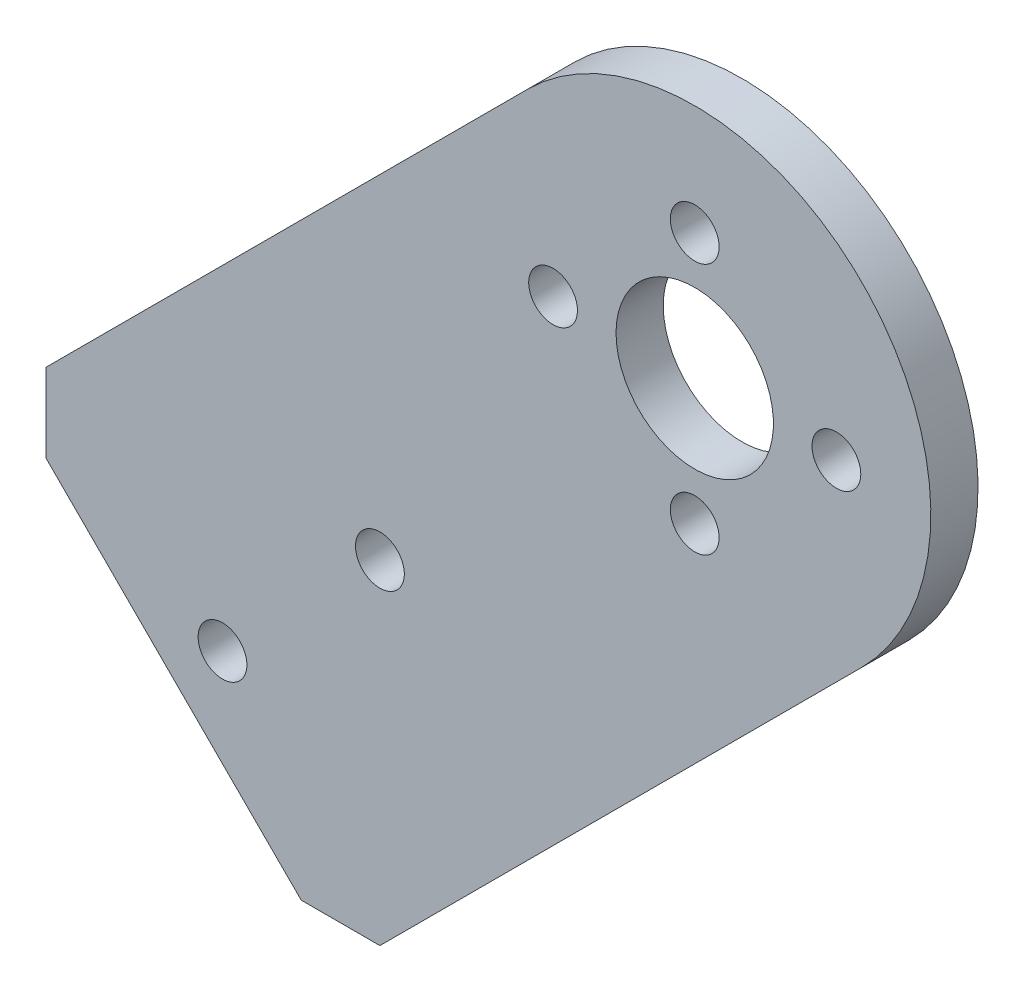
ISO-10303-21;
HEADER;
FILE_DESCRIPTION(('STEP AP214'),'2;1');
FILE_NAME('part.step','',(''),(''),'','','');
FILE_SCHEMA(('AUTOMOTIVE_DESIGN { 1 0 10303 214 1 1 1 1 }'));
ENDSEC;
DATA;
#1=APPLICATION_CONTEXT('core data for automotive mechanical design processes');
#2=APPLICATION_PROTOCOL_DEFINITION('international standard','automotive_design',2000,#1);
#3=PRODUCT_CONTEXT('',#1,'mechanical');
#4=PRODUCT('Part','Part','',(#3));
#5=PRODUCT_RELATED_PRODUCT_CATEGORY('part','',(#4));
#6=PRODUCT_DEFINITION_FORMATION('','',#4);
#7=PRODUCT_DEFINITION_CONTEXT('part definition',#1,'design');
#8=PRODUCT_DEFINITION('design','',#6,#7);
#9=PRODUCT_DEFINITION_SHAPE('','',#8);
#10=(LENGTH_UNIT() NAMED_UNIT(*) SI_UNIT(.MILLI.,.METRE.));
#11=(NAMED_UNIT(*) PLANE_ANGLE_UNIT() SI_UNIT($,.RADIAN.));
#12=(NAMED_UNIT(*) SI_UNIT($,.STERADIAN.) SOLID_ANGLE_UNIT());
#13=UNCERTAINTY_MEASURE_WITH_UNIT(LENGTH_MEASURE(1.E-05),#10,'distance_accuracy_value','');
#14=(GEOMETRIC_REPRESENTATION_CONTEXT(3) GLOBAL_UNCERTAINTY_ASSIGNED_CONTEXT((#13)) GLOBAL_UNIT_ASSIGNED_CONTEXT((#10,
#11,#12)) REPRESENTATION_CONTEXT('',''));
#15=CARTESIAN_POINT('',(0.,0.,0.));
#16=DIRECTION('',(0.,0.,1.));
#17=DIRECTION('',(1.,0.,0.));
#18=AXIS2_PLACEMENT_3D('',#15,#16,#17);
#19=CARTESIAN_POINT('',(0.,0.,3.));
#20=DIRECTION('',(0.,0.,-1.));
#21=DIRECTION('',(-1.,0.,0.));
#22=AXIS2_PLACEMENT_3D('',#19,#20,#21);
#23=PLANE('',#22);
#24=CARTESIAN_POINT('',(70.,70.,3.));
#25=DIRECTION('',(0.,0.,-1.));
#26=DIRECTION('',(-1.,0.,0.));
#27=AXIS2_PLACEMENT_3D('',#24,#25,#26);
#28=CIRCLE('',#27,1.54999999999999);
#29=CARTESIAN_POINT('',(68.45,70.,3.));
#30=VERTEX_POINT('',#29);
#31=EDGE_CURVE('E161',#30,#30,#28,.T.);
#32=ORIENTED_EDGE('',*,*,#31,.T.);
#33=EDGE_LOOP('',(#32));
#34=FACE_BOUND('',#33,.T.);
#35=DIRECTION('',(0.707106781186547,-0.707106781186548,0.));
#36=VECTOR('',#35,1.);
#37=CARTESIAN_POINT('',(56.8933982822018,56.8933982822018,3.));
#38=LINE('',#37,#36);
#39=CARTESIAN_POINT('',(48.7867965644036,65.,3.));
#40=VERTEX_POINT('',#39);
#41=CARTESIAN_POINT('',(65.,48.7867965644036,3.));
#42=VERTEX_POINT('',#41);
#43=EDGE_CURVE('E168',#40,#42,#38,.T.);
#44=ORIENTED_EDGE('',*,*,#43,.T.);
#45=DIRECTION('',(1.,0.,0.));
#46=VECTOR('',#45,1.);
#47=CARTESIAN_POINT('',(0.,48.7867965644036,3.));
#48=LINE('',#47,#46);
#49=CARTESIAN_POINT('',(70.,48.7867965644036,3.));
#50=VERTEX_POINT('',#49);
#51=EDGE_CURVE('E101',#42,#50,#48,.T.);
#52=ORIENTED_EDGE('',*,*,#51,.T.);
#53=DIRECTION('',(0.707106781186547,0.707106781186548,0.));
#54=VECTOR('',#53,1.);
#55=CARTESIAN_POINT('',(100.606601717798,79.3933982822018,3.));
#56=LINE('',#55,#54);
#57=CARTESIAN_POINT('',(100.606601717798,79.3933982822018,3.));
#58=VERTEX_POINT('',#57);
#59=EDGE_CURVE('E81',#50,#58,#56,.T.);
#60=ORIENTED_EDGE('',*,*,#59,.T.);
#61=CARTESIAN_POINT('',(90.,90.,3.));
#62=DIRECTION('',(0.,0.,1.));
#63=DIRECTION('',(-1.,0.,0.));
#64=AXIS2_PLACEMENT_3D('',#61,#62,#63);
#65=CIRCLE('',#64,15.);
#66=CARTESIAN_POINT('',(79.3933982822018,100.606601717798,3.));
#67=VERTEX_POINT('',#66);
#68=EDGE_CURVE('E88',#58,#67,#65,.T.);
#69=ORIENTED_EDGE('',*,*,#68,.T.);
#70=DIRECTION('',(-0.707106781186547,-0.707106781186547,0.));
#71=VECTOR('',#70,1.);
#72=CARTESIAN_POINT('',(79.3933982822018,100.606601717798,3.));
#73=LINE('',#72,#71);
#74=CARTESIAN_POINT('',(48.7867965644036,70.,3.));
#75=VERTEX_POINT('',#74);
#76=EDGE_CURVE('E94',#67,#75,#73,.T.);
#77=ORIENTED_EDGE('',*,*,#76,.T.);
#78=DIRECTION('',(0.,-1.,0.));
#79=VECTOR('',#78,1.);
#80=CARTESIAN_POINT('',(48.7867965644036,0.,3.));
#81=LINE('',#80,#79);
#82=EDGE_CURVE('E55',#75,#40,#81,.T.);
#83=ORIENTED_EDGE('',*,*,#82,.T.);
#84=EDGE_LOOP('',(#44,#52,#60,#69,#77,#83));
#85=FACE_BOUND('',#84,.T.);
#86=CARTESIAN_POINT('',(60.,60.,3.));
#87=DIRECTION('',(0.,0.,1.));
#88=DIRECTION('',(1.,0.,0.));
#89=AXIS2_PLACEMENT_3D('',#86,#87,#88);
#90=CIRCLE('',#89,1.55);
#91=CARTESIAN_POINT('',(61.55,60.,3.));
#92=VERTEX_POINT('',#91);
#93=EDGE_CURVE('E11',#92,#92,#90,.T.);
#94=ORIENTED_EDGE('',*,*,#93,.F.);
#95=EDGE_LOOP('',(#94));
#96=FACE_BOUND('',#95,.T.);
#97=CARTESIAN_POINT('',(99.,89.9999999999999,3.));
#98=DIRECTION('',(0.,0.,1.));
#99=DIRECTION('',(1.,0.,0.));
#100=AXIS2_PLACEMENT_3D('',#97,#98,#99);
#101=CIRCLE('',#100,1.54999999999999);
#102=CARTESIAN_POINT('',(100.55,89.9999999999999,3.));
#103=VERTEX_POINT('',#102);
#104=EDGE_CURVE('E157',#103,#103,#101,.T.);
#105=ORIENTED_EDGE('',*,*,#104,.F.);
#106=EDGE_LOOP('',(#105));
#107=FACE_BOUND('',#106,.T.);
#108=CARTESIAN_POINT('',(90.,98.,3.));
#109=DIRECTION('',(0.,0.,1.));
#110=DIRECTION('',(-1.,0.,0.));
#111=AXIS2_PLACEMENT_3D('',#108,#109,#110);
#112=CIRCLE('',#111,1.54999999999999);
#113=CARTESIAN_POINT('',(88.45,98.,3.));
#114=VERTEX_POINT('',#113);
#115=EDGE_CURVE('E149',#114,#114,#112,.T.);
#116=ORIENTED_EDGE('',*,*,#115,.F.);
#117=EDGE_LOOP('',(#116));
#118=FACE_BOUND('',#117,.T.);
#119=CARTESIAN_POINT('',(90.,82.,3.));
#120=DIRECTION('',(0.,0.,1.));
#121=DIRECTION('',(1.,0.,0.));
#122=AXIS2_PLACEMENT_3D('',#119,#120,#121);
#123=CIRCLE('',#122,1.54999999999999);
#124=CARTESIAN_POINT('',(91.55,82.,3.));
#125=VERTEX_POINT('',#124);
#126=EDGE_CURVE('E141',#125,#125,#123,.T.);
#127=ORIENTED_EDGE('',*,*,#126,.F.);
#128=EDGE_LOOP('',(#127));
#129=FACE_BOUND('',#128,.T.);
#130=CARTESIAN_POINT('',(90.,90.,3.));
#131=DIRECTION('',(0.,0.,1.));
#132=DIRECTION('',(-1.,0.,0.));
#133=AXIS2_PLACEMENT_3D('',#130,#131,#132);
#134=CIRCLE('',#133,5.00000000000001);
#135=CARTESIAN_POINT('',(85.,90.,3.));
#136=VERTEX_POINT('',#135);
#137=EDGE_CURVE('E133',#136,#136,#134,.T.);
#138=ORIENTED_EDGE('',*,*,#137,.F.);
#139=EDGE_LOOP('',(#138));
#140=FACE_BOUND('',#139,.T.);
#141=CARTESIAN_POINT('',(81.,90.,3.));
#142=DIRECTION('',(0.,0.,1.));
#143=DIRECTION('',(-1.,0.,0.));
#144=AXIS2_PLACEMENT_3D('',#141,#142,#143);
#145=CIRCLE('',#144,1.54999999999999);
#146=CARTESIAN_POINT('',(79.45,90.,3.));
#147=VERTEX_POINT('',#146);
#148=EDGE_CURVE('E125',#147,#147,#145,.T.);
#149=ORIENTED_EDGE('',*,*,#148,.F.);
#150=EDGE_LOOP('',(#149));
#151=FACE_BOUND('',#150,.T.);
#152=ADVANCED_FACE('F39',(#34,#85,#96,#107,#118,#129,#140,#151),#23,.F.);
#153=CARTESIAN_POINT('',(0.,0.,0.));
#154=DIRECTION('',(0.,0.,-1.));
#155=DIRECTION('',(-1.,0.,0.));
#156=AXIS2_PLACEMENT_3D('',#153,#154,#155);
#157=PLANE('',#156);
#158=CARTESIAN_POINT('',(70.,70.,0.));
#159=DIRECTION('',(0.,0.,-1.));
#160=DIRECTION('',(-1.,0.,0.));
#161=AXIS2_PLACEMENT_3D('',#158,#159,#160);
#162=CIRCLE('',#161,1.54999999999999);
#163=CARTESIAN_POINT('',(68.45,70.,0.));
#164=VERTEX_POINT('',#163);
#165=EDGE_CURVE('E195',#164,#164,#162,.T.);
#166=ORIENTED_EDGE('',*,*,#165,.F.);
#167=EDGE_LOOP('',(#166));
#168=FACE_BOUND('',#167,.T.);
#169=DIRECTION('',(1.,0.,0.));
#170=VECTOR('',#169,1.);
#171=CARTESIAN_POINT('',(70.,48.7867965644036,0.));
#172=LINE('',#171,#170);
#173=CARTESIAN_POINT('',(65.,48.7867965644036,0.));
#174=VERTEX_POINT('',#173);
#175=CARTESIAN_POINT('',(70.,48.7867965644036,0.));
#176=VERTEX_POINT('',#175);
#177=EDGE_CURVE('E180',#174,#176,#172,.T.);
#178=ORIENTED_EDGE('',*,*,#177,.F.);
#179=DIRECTION('',(0.707106781186547,-0.707106781186548,0.));
#180=VECTOR('',#179,1.);
#181=CARTESIAN_POINT('',(65.,48.7867965644036,0.));
#182=LINE('',#181,#180);
#183=CARTESIAN_POINT('',(48.7867965644036,65.,0.));
#184=VERTEX_POINT('',#183);
#185=EDGE_CURVE('E187',#184,#174,#182,.T.);
#186=ORIENTED_EDGE('',*,*,#185,.F.);
#187=DIRECTION('',(0.,-1.,0.));
#188=VECTOR('',#187,1.);
#189=CARTESIAN_POINT('',(48.7867965644036,65.,0.));
#190=LINE('',#189,#188);
#191=CARTESIAN_POINT('',(48.7867965644036,70.,0.));
#192=VERTEX_POINT('',#191);
#193=EDGE_CURVE('E191',#192,#184,#190,.T.);
#194=ORIENTED_EDGE('',*,*,#193,.F.);
#195=DIRECTION('',(-0.707106781186547,-0.707106781186547,0.));
#196=VECTOR('',#195,1.);
#197=CARTESIAN_POINT('',(79.3933982822018,100.606601717798,0.));
#198=LINE('',#197,#196);
#199=CARTESIAN_POINT('',(79.3933982822018,100.606601717798,0.));
#200=VERTEX_POINT('',#199);
#201=EDGE_CURVE('E107',#200,#192,#198,.T.);
#202=ORIENTED_EDGE('',*,*,#201,.F.);
#203=CARTESIAN_POINT('',(90.,90.,0.));
#204=DIRECTION('',(0.,0.,1.));
#205=DIRECTION('',(-1.,0.,0.));
#206=AXIS2_PLACEMENT_3D('',#203,#204,#205);
#207=CIRCLE('',#206,15.);
#208=CARTESIAN_POINT('',(100.606601717798,79.3933982822018,0.));
#209=VERTEX_POINT('',#208);
#210=EDGE_CURVE('E103',#209,#200,#207,.T.);
#211=ORIENTED_EDGE('',*,*,#210,.F.);
#212=DIRECTION('',(0.707106781186547,0.707106781186548,0.));
#213=VECTOR('',#212,1.);
#214=CARTESIAN_POINT('',(100.606601717798,79.3933982822018,0.));
#215=LINE('',#214,#213);
#216=EDGE_CURVE('E83',#176,#209,#215,.T.);
#217=ORIENTED_EDGE('',*,*,#216,.F.);
#218=EDGE_LOOP('',(#178,#186,#194,#202,#211,#217));
#219=FACE_BOUND('',#218,.T.);
#220=CARTESIAN_POINT('',(60.,60.,0.));
#221=DIRECTION('',(0.,0.,1.));
#222=DIRECTION('',(1.,0.,0.));
#223=AXIS2_PLACEMENT_3D('',#220,#221,#222);
#224=CIRCLE('',#223,1.55);
#225=CARTESIAN_POINT('',(61.55,60.,0.));
#226=VERTEX_POINT('',#225);
#227=EDGE_CURVE('E43',#226,#226,#224,.T.);
#228=ORIENTED_EDGE('',*,*,#227,.T.);
#229=EDGE_LOOP('',(#228));
#230=FACE_BOUND('',#229,.T.);
#231=CARTESIAN_POINT('',(99.,89.9999999999999,0.));
#232=DIRECTION('',(0.,0.,1.));
#233=DIRECTION('',(1.,0.,0.));
#234=AXIS2_PLACEMENT_3D('',#231,#232,#233);
#235=CIRCLE('',#234,1.54999999999999);
#236=CARTESIAN_POINT('',(100.55,89.9999999999999,0.));
#237=VERTEX_POINT('',#236);
#238=EDGE_CURVE('E153',#237,#237,#235,.T.);
#239=ORIENTED_EDGE('',*,*,#238,.T.);
#240=EDGE_LOOP('',(#239));
#241=FACE_BOUND('',#240,.T.);
#242=CARTESIAN_POINT('',(90.,98.,0.));
#243=DIRECTION('',(0.,0.,1.));
#244=DIRECTION('',(-1.,0.,0.));
#245=AXIS2_PLACEMENT_3D('',#242,#243,#244);
#246=CIRCLE('',#245,1.54999999999999);
#247=CARTESIAN_POINT('',(88.45,98.,0.));
#248=VERTEX_POINT('',#247);
#249=EDGE_CURVE('E145',#248,#248,#246,.T.);
#250=ORIENTED_EDGE('',*,*,#249,.T.);
#251=EDGE_LOOP('',(#250));
#252=FACE_BOUND('',#251,.T.);
#253=CARTESIAN_POINT('',(90.,82.,0.));
#254=DIRECTION('',(0.,0.,1.));
#255=DIRECTION('',(1.,0.,0.));
#256=AXIS2_PLACEMENT_3D('',#253,#254,#255);
#257=CIRCLE('',#256,1.54999999999999);
#258=CARTESIAN_POINT('',(91.55,82.,0.));
#259=VERTEX_POINT('',#258);
#260=EDGE_CURVE('E137',#259,#259,#257,.T.);
#261=ORIENTED_EDGE('',*,*,#260,.T.);
#262=EDGE_LOOP('',(#261));
#263=FACE_BOUND('',#262,.T.);
#264=CARTESIAN_POINT('',(90.,90.,0.));
#265=DIRECTION('',(0.,0.,1.));
#266=DIRECTION('',(-1.,0.,0.));
#267=AXIS2_PLACEMENT_3D('',#264,#265,#266);
#268=CIRCLE('',#267,5.00000000000001);
#269=CARTESIAN_POINT('',(85.,90.,0.));
#270=VERTEX_POINT('',#269);
#271=EDGE_CURVE('E129',#270,#270,#268,.T.);
#272=ORIENTED_EDGE('',*,*,#271,.T.);
#273=EDGE_LOOP('',(#272));
#274=FACE_BOUND('',#273,.T.);
#275=CARTESIAN_POINT('',(81.,90.,0.));
#276=DIRECTION('',(0.,0.,1.));
#277=DIRECTION('',(-1.,0.,0.));
#278=AXIS2_PLACEMENT_3D('',#275,#276,#277);
#279=CIRCLE('',#278,1.54999999999999);
#280=CARTESIAN_POINT('',(79.45,90.,0.));
#281=VERTEX_POINT('',#280);
#282=EDGE_CURVE('E95',#281,#281,#279,.T.);
#283=ORIENTED_EDGE('',*,*,#282,.T.);
#284=EDGE_LOOP('',(#283));
#285=FACE_BOUND('',#284,.T.);
#286=ADVANCED_FACE('F41',(#168,#219,#230,#241,#252,#263,#274,#285),#157,.T.);
#287=CARTESIAN_POINT('',(60.,60.,3.));
#288=DIRECTION('',(0.,0.,-1.));
#289=DIRECTION('',(-1.,0.,0.));
#290=AXIS2_PLACEMENT_3D('',#287,#288,#289);
#291=CYLINDRICAL_SURFACE('',#290,1.55);
#292=ORIENTED_EDGE('',*,*,#93,.T.);
#293=EDGE_LOOP('',(#292));
#294=FACE_BOUND('',#293,.T.);
#295=ORIENTED_EDGE('',*,*,#227,.F.);
#296=EDGE_LOOP('',(#295));
#297=FACE_BOUND('',#296,.T.);
#298=ADVANCED_FACE('F205',(#294,#297),#291,.F.);
#299=CARTESIAN_POINT('',(90.,90.,0.));
#300=DIRECTION('',(0.,0.,1.));
#301=DIRECTION('',(1.,0.,0.));
#302=AXIS2_PLACEMENT_3D('',#299,#300,#301);
#303=CYLINDRICAL_SURFACE('',#302,15.);
#304=ORIENTED_EDGE('',*,*,#68,.F.);
#305=DIRECTION('',(0.,0.,1.));
#306=VECTOR('',#305,1.);
#307=CARTESIAN_POINT('',(100.606601717798,79.3933982822018,0.));
#308=LINE('',#307,#306);
#309=EDGE_CURVE('E64',#209,#58,#308,.T.);
#310=ORIENTED_EDGE('',*,*,#309,.F.);
#311=ORIENTED_EDGE('',*,*,#210,.T.);
#312=DIRECTION('',(0.,0.,1.));
#313=VECTOR('',#312,1.);
#314=CARTESIAN_POINT('',(79.3933982822018,100.606601717798,0.));
#315=LINE('',#314,#313);
#316=EDGE_CURVE('E90',#200,#67,#315,.T.);
#317=ORIENTED_EDGE('',*,*,#316,.T.);
#318=EDGE_LOOP('',(#304,#310,#311,#317));
#319=FACE_BOUND('',#318,.T.);
#320=ADVANCED_FACE('F89',(#319),#303,.T.);
#321=CARTESIAN_POINT('',(100.606601717798,79.3933982822018,0.));
#322=DIRECTION('',(0.707106781186548,-0.707106781186547,0.));
#323=DIRECTION('',(0.707106781186547,0.707106781186548,0.));
#324=AXIS2_PLACEMENT_3D('',#321,#322,#323);
#325=PLANE('',#324);
#326=ORIENTED_EDGE('',*,*,#59,.F.);
#327=DIRECTION('',(0.,0.,1.));
#328=VECTOR('',#327,1.);
#329=CARTESIAN_POINT('',(70.,48.7867965644036,0.));
#330=LINE('',#329,#328);
#331=EDGE_CURVE('E85',#176,#50,#330,.T.);
#332=ORIENTED_EDGE('',*,*,#331,.F.);
#333=ORIENTED_EDGE('',*,*,#216,.T.);
#334=ORIENTED_EDGE('',*,*,#309,.T.);
#335=EDGE_LOOP('',(#326,#332,#333,#334));
#336=FACE_BOUND('',#335,.T.);
#337=ADVANCED_FACE('F77',(#336),#325,.T.);
#338=CARTESIAN_POINT('',(79.3933982822018,100.606601717798,0.));
#339=DIRECTION('',(-0.707106781186548,0.707106781186548,0.));
#340=DIRECTION('',(-0.707106781186548,-0.707106781186548,0.));
#341=AXIS2_PLACEMENT_3D('',#338,#339,#340);
#342=PLANE('',#341);
#343=ORIENTED_EDGE('',*,*,#76,.F.);
#344=ORIENTED_EDGE('',*,*,#316,.F.);
#345=ORIENTED_EDGE('',*,*,#201,.T.);
#346=DIRECTION('',(0.,0.,1.));
#347=VECTOR('',#346,1.);
#348=CARTESIAN_POINT('',(48.7867965644036,70.,0.));
#349=LINE('',#348,#347);
#350=EDGE_CURVE('E114',#192,#75,#349,.T.);
#351=ORIENTED_EDGE('',*,*,#350,.T.);
#352=EDGE_LOOP('',(#343,#344,#345,#351));
#353=FACE_BOUND('',#352,.T.);
#354=ADVANCED_FACE('F227',(#353),#342,.T.);
#355=CARTESIAN_POINT('',(81.,90.,0.));
#356=DIRECTION('',(0.,0.,1.));
#357=DIRECTION('',(1.,0.,0.));
#358=AXIS2_PLACEMENT_3D('',#355,#356,#357);
#359=CYLINDRICAL_SURFACE('',#358,1.54999999999999);
#360=ORIENTED_EDGE('',*,*,#282,.F.);
#361=EDGE_LOOP('',(#360));
#362=FACE_BOUND('',#361,.T.);
#363=ORIENTED_EDGE('',*,*,#148,.T.);
#364=EDGE_LOOP('',(#363));
#365=FACE_BOUND('',#364,.T.);
#366=ADVANCED_FACE('F223',(#362,#365),#359,.F.);
#367=CARTESIAN_POINT('',(90.,90.,0.));
#368=DIRECTION('',(0.,0.,1.));
#369=DIRECTION('',(1.,0.,0.));
#370=AXIS2_PLACEMENT_3D('',#367,#368,#369);
#371=CYLINDRICAL_SURFACE('',#370,5.00000000000001);
#372=ORIENTED_EDGE('',*,*,#271,.F.);
#373=EDGE_LOOP('',(#372));
#374=FACE_BOUND('',#373,.T.);
#375=ORIENTED_EDGE('',*,*,#137,.T.);
#376=EDGE_LOOP('',(#375));
#377=FACE_BOUND('',#376,.T.);
#378=ADVANCED_FACE('F226',(#374,#377),#371,.F.);
#379=CARTESIAN_POINT('',(90.,82.,0.));
#380=DIRECTION('',(0.,0.,1.));
#381=DIRECTION('',(1.,0.,0.));
#382=AXIS2_PLACEMENT_3D('',#379,#380,#381);
#383=CYLINDRICAL_SURFACE('',#382,1.54999999999999);
#384=ORIENTED_EDGE('',*,*,#260,.F.);
#385=EDGE_LOOP('',(#384));
#386=FACE_BOUND('',#385,.T.);
#387=ORIENTED_EDGE('',*,*,#126,.T.);
#388=EDGE_LOOP('',(#387));
#389=FACE_BOUND('',#388,.T.);
#390=ADVANCED_FACE('F248',(#386,#389),#383,.F.);
#391=CARTESIAN_POINT('',(90.,98.,0.));
#392=DIRECTION('',(0.,0.,1.));
#393=DIRECTION('',(1.,0.,0.));
#394=AXIS2_PLACEMENT_3D('',#391,#392,#393);
#395=CYLINDRICAL_SURFACE('',#394,1.54999999999999);
#396=ORIENTED_EDGE('',*,*,#249,.F.);
#397=EDGE_LOOP('',(#396));
#398=FACE_BOUND('',#397,.T.);
#399=ORIENTED_EDGE('',*,*,#115,.T.);
#400=EDGE_LOOP('',(#399));
#401=FACE_BOUND('',#400,.T.);
#402=ADVANCED_FACE('F252',(#398,#401),#395,.F.);
#403=CARTESIAN_POINT('',(99.,89.9999999999999,0.));
#404=DIRECTION('',(0.,0.,1.));
#405=DIRECTION('',(1.,0.,0.));
#406=AXIS2_PLACEMENT_3D('',#403,#404,#405);
#407=CYLINDRICAL_SURFACE('',#406,1.54999999999999);
#408=ORIENTED_EDGE('',*,*,#238,.F.);
#409=EDGE_LOOP('',(#408));
#410=FACE_BOUND('',#409,.T.);
#411=ORIENTED_EDGE('',*,*,#104,.T.);
#412=EDGE_LOOP('',(#411));
#413=FACE_BOUND('',#412,.T.);
#414=ADVANCED_FACE('F256',(#410,#413),#407,.F.);
#415=CARTESIAN_POINT('',(65.,48.7867965644036,10.));
#416=DIRECTION('',(0.707106781186548,0.707106781186547,0.));
#417=DIRECTION('',(-0.707106781186547,0.707106781186548,0.));
#418=AXIS2_PLACEMENT_3D('',#415,#416,#417);
#419=PLANE('',#418);
#420=DIRECTION('',(0.,0.,-1.));
#421=VECTOR('',#420,1.);
#422=CARTESIAN_POINT('',(48.7867965644036,65.,10.));
#423=LINE('',#422,#421);
#424=EDGE_CURVE('E176',#40,#184,#423,.T.);
#425=ORIENTED_EDGE('',*,*,#424,.T.);
#426=ORIENTED_EDGE('',*,*,#185,.T.);
#427=DIRECTION('',(0.,0.,-1.));
#428=VECTOR('',#427,1.);
#429=CARTESIAN_POINT('',(65.,48.7867965644036,10.));
#430=LINE('',#429,#428);
#431=EDGE_CURVE('E175',#42,#174,#430,.T.);
#432=ORIENTED_EDGE('',*,*,#431,.F.);
#433=ORIENTED_EDGE('',*,*,#43,.F.);
#434=EDGE_LOOP('',(#425,#426,#432,#433));
#435=FACE_BOUND('',#434,.T.);
#436=ADVANCED_FACE('F260',(#435),#419,.F.);
#437=CARTESIAN_POINT('',(70.,48.7867965644036,10.));
#438=DIRECTION('',(0.,1.,0.));
#439=DIRECTION('',(0.,0.,1.));
#440=AXIS2_PLACEMENT_3D('',#437,#438,#439);
#441=PLANE('',#440);
#442=ORIENTED_EDGE('',*,*,#431,.T.);
#443=ORIENTED_EDGE('',*,*,#177,.T.);
#444=ORIENTED_EDGE('',*,*,#331,.T.);
#445=ORIENTED_EDGE('',*,*,#51,.F.);
#446=EDGE_LOOP('',(#442,#443,#444,#445));
#447=FACE_BOUND('',#446,.T.);
#448=ADVANCED_FACE('F265',(#447),#441,.F.);
#449=CARTESIAN_POINT('',(48.7867965644036,65.,10.));
#450=DIRECTION('',(1.,0.,0.));
#451=DIRECTION('',(0.,0.,-1.));
#452=AXIS2_PLACEMENT_3D('',#449,#450,#451);
#453=PLANE('',#452);
#454=ORIENTED_EDGE('',*,*,#350,.F.);
#455=ORIENTED_EDGE('',*,*,#193,.T.);
#456=ORIENTED_EDGE('',*,*,#424,.F.);
#457=ORIENTED_EDGE('',*,*,#82,.F.);
#458=EDGE_LOOP('',(#454,#455,#456,#457));
#459=FACE_BOUND('',#458,.T.);
#460=ADVANCED_FACE('F262',(#459),#453,.F.);
#461=CARTESIAN_POINT('',(70.,70.,10.));
#462=DIRECTION('',(0.,0.,-1.));
#463=DIRECTION('',(-1.,0.,0.));
#464=AXIS2_PLACEMENT_3D('',#461,#462,#463);
#465=CYLINDRICAL_SURFACE('',#464,1.54999999999999);
#466=ORIENTED_EDGE('',*,*,#165,.T.);
#467=EDGE_LOOP('',(#466));
#468=FACE_BOUND('',#467,.T.);
#469=ORIENTED_EDGE('',*,*,#31,.F.);
#470=EDGE_LOOP('',(#469));
#471=FACE_BOUND('',#470,.T.);
#472=ADVANCED_FACE('F200',(#468,#471),#465,.F.);
#473=CLOSED_SHELL('',(#152,#286,#298,#320,#337,#354,#366,#378,#390,#402,#414,#436,#448,#460,#472));
#474=MANIFOLD_SOLID_BREP('B2',#473);
#475=ADVANCED_BREP_SHAPE_REPRESENTATION('',(#18,#474),#14);
#476=SHAPE_DEFINITION_REPRESENTATION(#9,#475);
ENDSEC;
END-ISO-10303-21;
